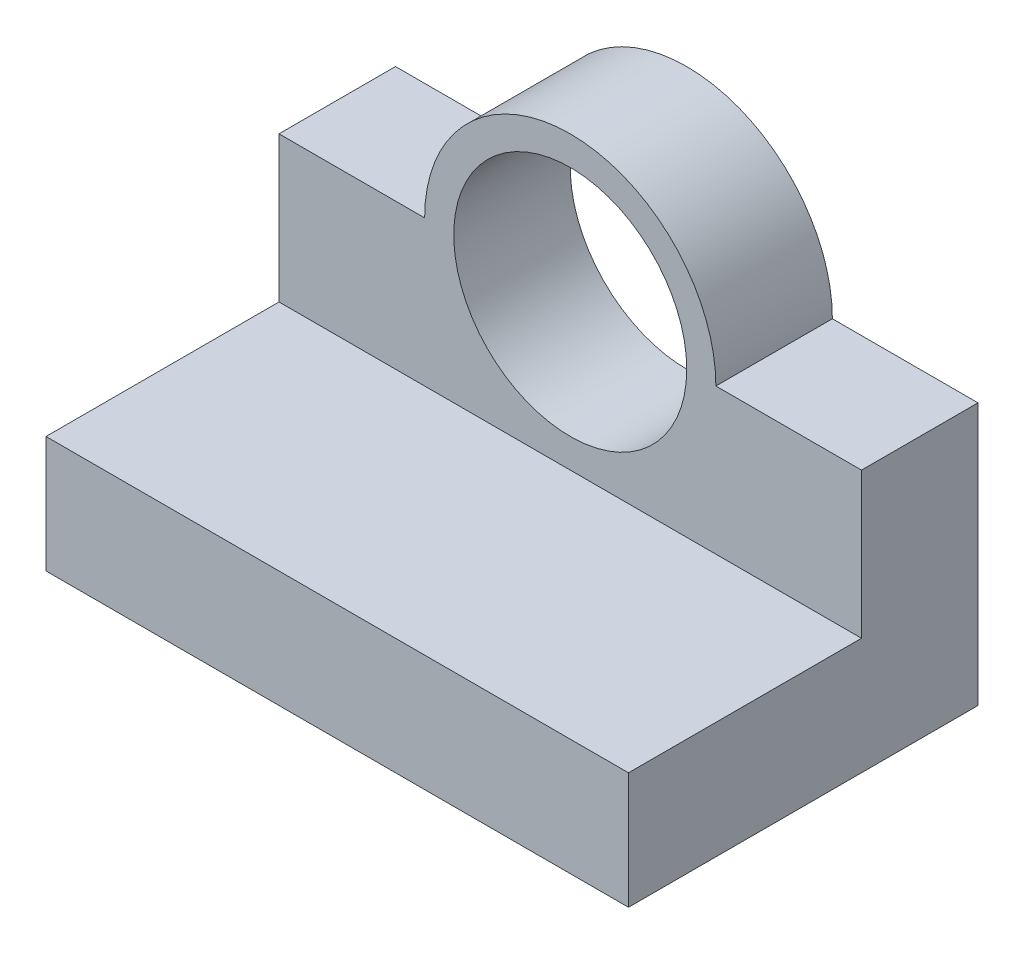
ISO-10303-21;
HEADER;
FILE_DESCRIPTION(('STEP AP214'),'2;1');
FILE_NAME('part.step','',(''),(''),'','','');
FILE_SCHEMA(('AUTOMOTIVE_DESIGN { 1 0 10303 214 1 1 1 1 }'));
ENDSEC;
DATA;
#1=APPLICATION_CONTEXT('core data for automotive mechanical design processes');
#2=APPLICATION_PROTOCOL_DEFINITION('international standard','automotive_design',2000,#1);
#3=PRODUCT_CONTEXT('',#1,'mechanical');
#4=PRODUCT('Part','Part','',(#3));
#5=PRODUCT_RELATED_PRODUCT_CATEGORY('part','',(#4));
#6=PRODUCT_DEFINITION_FORMATION('','',#4);
#7=PRODUCT_DEFINITION_CONTEXT('part definition',#1,'design');
#8=PRODUCT_DEFINITION('design','',#6,#7);
#9=PRODUCT_DEFINITION_SHAPE('','',#8);
#10=(LENGTH_UNIT() NAMED_UNIT(*) SI_UNIT(.MILLI.,.METRE.));
#11=(NAMED_UNIT(*) PLANE_ANGLE_UNIT() SI_UNIT($,.RADIAN.));
#12=(NAMED_UNIT(*) SI_UNIT($,.STERADIAN.) SOLID_ANGLE_UNIT());
#13=UNCERTAINTY_MEASURE_WITH_UNIT(LENGTH_MEASURE(1.E-05),#10,'distance_accuracy_value','');
#14=(GEOMETRIC_REPRESENTATION_CONTEXT(3) GLOBAL_UNCERTAINTY_ASSIGNED_CONTEXT((#13)) GLOBAL_UNIT_ASSIGNED_CONTEXT((#10,
#11,#12)) REPRESENTATION_CONTEXT('',''));
#15=CARTESIAN_POINT('',(0.,0.,0.));
#16=DIRECTION('',(0.,0.,1.));
#17=DIRECTION('',(1.,0.,0.));
#18=AXIS2_PLACEMENT_3D('',#15,#16,#17);
#19=CARTESIAN_POINT('',(0.,45.,10.));
#20=DIRECTION('',(0.,0.,1.));
#21=DIRECTION('',(1.,0.,0.));
#22=AXIS2_PLACEMENT_3D('',#19,#20,#21);
#23=PLANE('',#22);
#24=DIRECTION('',(-1.,0.,0.));
#25=VECTOR('',#24,1.);
#26=CARTESIAN_POINT('',(-50.,20.,10.));
#27=LINE('',#26,#25);
#28=CARTESIAN_POINT('',(50.,20.,10.));
#29=VERTEX_POINT('',#28);
#30=CARTESIAN_POINT('',(-50.,20.,10.));
#31=VERTEX_POINT('',#30);
#32=EDGE_CURVE('E49',#29,#31,#27,.T.);
#33=ORIENTED_EDGE('',*,*,#32,.F.);
#34=DIRECTION('',(0.,1.,0.));
#35=VECTOR('',#34,1.);
#36=CARTESIAN_POINT('',(50.,0.,10.));
#37=LINE('',#36,#35);
#38=CARTESIAN_POINT('',(50.,45.,10.));
#39=VERTEX_POINT('',#38);
#40=EDGE_CURVE('E87',#29,#39,#37,.T.);
#41=ORIENTED_EDGE('',*,*,#40,.T.);
#42=DIRECTION('',(-1.,0.,0.));
#43=VECTOR('',#42,1.);
#44=CARTESIAN_POINT('',(25.,45.,10.));
#45=LINE('',#44,#43);
#46=CARTESIAN_POINT('',(25.,45.,10.));
#47=VERTEX_POINT('',#46);
#48=EDGE_CURVE('E143',#39,#47,#45,.T.);
#49=ORIENTED_EDGE('',*,*,#48,.T.);
#50=CARTESIAN_POINT('',(0.,45.,10.));
#51=DIRECTION('',(0.,0.,1.));
#52=DIRECTION('',(1.,0.,0.));
#53=AXIS2_PLACEMENT_3D('',#50,#51,#52);
#54=CIRCLE('',#53,25.);
#55=CARTESIAN_POINT('',(-25.,45.,10.));
#56=VERTEX_POINT('',#55);
#57=EDGE_CURVE('E145',#47,#56,#54,.T.);
#58=ORIENTED_EDGE('',*,*,#57,.T.);
#59=DIRECTION('',(-1.,0.,0.));
#60=VECTOR('',#59,1.);
#61=CARTESIAN_POINT('',(-50.,45.,10.));
#62=LINE('',#61,#60);
#63=CARTESIAN_POINT('',(-50.,45.,10.));
#64=VERTEX_POINT('',#63);
#65=EDGE_CURVE('E56',#56,#64,#62,.T.);
#66=ORIENTED_EDGE('',*,*,#65,.T.);
#67=DIRECTION('',(0.,-1.,0.));
#68=VECTOR('',#67,1.);
#69=CARTESIAN_POINT('',(-50.,0.,10.));
#70=LINE('',#69,#68);
#71=EDGE_CURVE('E140',#64,#31,#70,.T.);
#72=ORIENTED_EDGE('',*,*,#71,.T.);
#73=EDGE_LOOP('',(#33,#41,#49,#58,#66,#72));
#74=FACE_BOUND('',#73,.T.);
#75=CARTESIAN_POINT('',(0.,45.,10.));
#76=DIRECTION('',(0.,0.,1.));
#77=DIRECTION('',(1.,0.,0.));
#78=AXIS2_PLACEMENT_3D('',#75,#76,#77);
#79=CIRCLE('',#78,20.);
#80=CARTESIAN_POINT('',(20.,45.,10.));
#81=VERTEX_POINT('',#80);
#82=EDGE_CURVE('E135',#81,#81,#79,.T.);
#83=ORIENTED_EDGE('',*,*,#82,.F.);
#84=EDGE_LOOP('',(#83));
#85=FACE_BOUND('',#84,.T.);
#86=ADVANCED_FACE('F34',(#74,#85),#23,.T.);
#87=CARTESIAN_POINT('',(0.,45.,-10.));
#88=DIRECTION('',(0.,0.,1.));
#89=DIRECTION('',(1.,0.,0.));
#90=AXIS2_PLACEMENT_3D('',#87,#88,#89);
#91=PLANE('',#90);
#92=DIRECTION('',(0.,-1.,0.));
#93=VECTOR('',#92,1.);
#94=CARTESIAN_POINT('',(-50.,0.,-10.));
#95=LINE('',#94,#93);
#96=CARTESIAN_POINT('',(-50.,45.,-10.));
#97=VERTEX_POINT('',#96);
#98=CARTESIAN_POINT('',(-50.,0.,-10.));
#99=VERTEX_POINT('',#98);
#100=EDGE_CURVE('E110',#97,#99,#95,.T.);
#101=ORIENTED_EDGE('',*,*,#100,.F.);
#102=DIRECTION('',(-1.,0.,0.));
#103=VECTOR('',#102,1.);
#104=CARTESIAN_POINT('',(-50.,45.,-10.));
#105=LINE('',#104,#103);
#106=CARTESIAN_POINT('',(-25.,45.,-10.));
#107=VERTEX_POINT('',#106);
#108=EDGE_CURVE('E83',#107,#97,#105,.T.);
#109=ORIENTED_EDGE('',*,*,#108,.F.);
#110=CARTESIAN_POINT('',(0.,45.,-10.));
#111=DIRECTION('',(0.,0.,1.));
#112=DIRECTION('',(1.,0.,0.));
#113=AXIS2_PLACEMENT_3D('',#110,#111,#112);
#114=CIRCLE('',#113,25.);
#115=CARTESIAN_POINT('',(25.,45.,-10.));
#116=VERTEX_POINT('',#115);
#117=EDGE_CURVE('E156',#116,#107,#114,.T.);
#118=ORIENTED_EDGE('',*,*,#117,.F.);
#119=DIRECTION('',(-1.,0.,0.));
#120=VECTOR('',#119,1.);
#121=CARTESIAN_POINT('',(25.,45.,-10.));
#122=LINE('',#121,#120);
#123=CARTESIAN_POINT('',(50.,45.,-10.));
#124=VERTEX_POINT('',#123);
#125=EDGE_CURVE('E154',#124,#116,#122,.T.);
#126=ORIENTED_EDGE('',*,*,#125,.F.);
#127=DIRECTION('',(0.,1.,0.));
#128=VECTOR('',#127,1.);
#129=CARTESIAN_POINT('',(50.,0.,-10.));
#130=LINE('',#129,#128);
#131=CARTESIAN_POINT('',(50.,0.,-10.));
#132=VERTEX_POINT('',#131);
#133=EDGE_CURVE('E152',#132,#124,#130,.T.);
#134=ORIENTED_EDGE('',*,*,#133,.F.);
#135=DIRECTION('',(1.,0.,0.));
#136=VECTOR('',#135,1.);
#137=CARTESIAN_POINT('',(-50.,0.,-10.));
#138=LINE('',#137,#136);
#139=EDGE_CURVE('E150',#99,#132,#138,.T.);
#140=ORIENTED_EDGE('',*,*,#139,.F.);
#141=EDGE_LOOP('',(#101,#109,#118,#126,#134,#140));
#142=FACE_BOUND('',#141,.T.);
#143=CARTESIAN_POINT('',(0.,45.,-10.));
#144=DIRECTION('',(0.,0.,1.));
#145=DIRECTION('',(1.,0.,0.));
#146=AXIS2_PLACEMENT_3D('',#143,#144,#145);
#147=CIRCLE('',#146,20.);
#148=CARTESIAN_POINT('',(20.,45.,-10.));
#149=VERTEX_POINT('',#148);
#150=EDGE_CURVE('E134',#149,#149,#147,.T.);
#151=ORIENTED_EDGE('',*,*,#150,.T.);
#152=EDGE_LOOP('',(#151));
#153=FACE_BOUND('',#152,.T.);
#154=ADVANCED_FACE('F173',(#142,#153),#91,.F.);
#155=CARTESIAN_POINT('',(-50.,0.,10.));
#156=DIRECTION('',(1.,0.,0.));
#157=DIRECTION('',(0.,0.,-1.));
#158=AXIS2_PLACEMENT_3D('',#155,#156,#157);
#159=PLANE('',#158);
#160=ORIENTED_EDGE('',*,*,#100,.T.);
#161=DIRECTION('',(0.,0.,-1.));
#162=VECTOR('',#161,1.);
#163=CARTESIAN_POINT('',(-50.,0.,10.));
#164=LINE('',#163,#162);
#165=CARTESIAN_POINT('',(-50.,0.,50.));
#166=VERTEX_POINT('',#165);
#167=EDGE_CURVE('E11',#166,#99,#164,.T.);
#168=ORIENTED_EDGE('',*,*,#167,.F.);
#169=DIRECTION('',(0.,-1.,0.));
#170=VECTOR('',#169,1.);
#171=CARTESIAN_POINT('',(-50.,0.,50.));
#172=LINE('',#171,#170);
#173=CARTESIAN_POINT('',(-50.,20.,50.));
#174=VERTEX_POINT('',#173);
#175=EDGE_CURVE('E108',#174,#166,#172,.T.);
#176=ORIENTED_EDGE('',*,*,#175,.F.);
#177=DIRECTION('',(0.,0.,-1.));
#178=VECTOR('',#177,1.);
#179=CARTESIAN_POINT('',(-50.,20.,50.));
#180=LINE('',#179,#178);
#181=EDGE_CURVE('E128',#174,#31,#180,.T.);
#182=ORIENTED_EDGE('',*,*,#181,.T.);
#183=ORIENTED_EDGE('',*,*,#71,.F.);
#184=DIRECTION('',(0.,0.,-1.));
#185=VECTOR('',#184,1.);
#186=CARTESIAN_POINT('',(-50.,45.,10.));
#187=LINE('',#186,#185);
#188=EDGE_CURVE('E148',#64,#97,#187,.T.);
#189=ORIENTED_EDGE('',*,*,#188,.T.);
#190=EDGE_LOOP('',(#160,#168,#176,#182,#183,#189));
#191=FACE_BOUND('',#190,.T.);
#192=ADVANCED_FACE('F36',(#191),#159,.F.);
#193=CARTESIAN_POINT('',(-50.,0.,10.));
#194=DIRECTION('',(0.,1.,0.));
#195=DIRECTION('',(0.,0.,1.));
#196=AXIS2_PLACEMENT_3D('',#193,#194,#195);
#197=PLANE('',#196);
#198=ORIENTED_EDGE('',*,*,#139,.T.);
#199=DIRECTION('',(0.,0.,-1.));
#200=VECTOR('',#199,1.);
#201=CARTESIAN_POINT('',(50.,0.,10.));
#202=LINE('',#201,#200);
#203=CARTESIAN_POINT('',(50.,0.,50.));
#204=VERTEX_POINT('',#203);
#205=EDGE_CURVE('E42',#204,#132,#202,.T.);
#206=ORIENTED_EDGE('',*,*,#205,.F.);
#207=DIRECTION('',(1.,0.,0.));
#208=VECTOR('',#207,1.);
#209=CARTESIAN_POINT('',(-50.,0.,50.));
#210=LINE('',#209,#208);
#211=EDGE_CURVE('E113',#166,#204,#210,.T.);
#212=ORIENTED_EDGE('',*,*,#211,.F.);
#213=ORIENTED_EDGE('',*,*,#167,.T.);
#214=EDGE_LOOP('',(#198,#206,#212,#213));
#215=FACE_BOUND('',#214,.T.);
#216=ADVANCED_FACE('F114',(#215),#197,.F.);
#217=CARTESIAN_POINT('',(50.,0.,10.));
#218=DIRECTION('',(-1.,0.,0.));
#219=DIRECTION('',(0.,0.,1.));
#220=AXIS2_PLACEMENT_3D('',#217,#218,#219);
#221=PLANE('',#220);
#222=ORIENTED_EDGE('',*,*,#133,.T.);
#223=DIRECTION('',(0.,0.,-1.));
#224=VECTOR('',#223,1.);
#225=CARTESIAN_POINT('',(50.,45.,10.));
#226=LINE('',#225,#224);
#227=EDGE_CURVE('E165',#39,#124,#226,.T.);
#228=ORIENTED_EDGE('',*,*,#227,.F.);
#229=ORIENTED_EDGE('',*,*,#40,.F.);
#230=DIRECTION('',(0.,0.,-1.));
#231=VECTOR('',#230,1.);
#232=CARTESIAN_POINT('',(50.,20.,50.));
#233=LINE('',#232,#231);
#234=CARTESIAN_POINT('',(50.,20.,50.));
#235=VERTEX_POINT('',#234);
#236=EDGE_CURVE('E131',#235,#29,#233,.T.);
#237=ORIENTED_EDGE('',*,*,#236,.F.);
#238=DIRECTION('',(0.,1.,0.));
#239=VECTOR('',#238,1.);
#240=CARTESIAN_POINT('',(50.,0.,50.));
#241=LINE('',#240,#239);
#242=EDGE_CURVE('E118',#204,#235,#241,.T.);
#243=ORIENTED_EDGE('',*,*,#242,.F.);
#244=ORIENTED_EDGE('',*,*,#205,.T.);
#245=EDGE_LOOP('',(#222,#228,#229,#237,#243,#244));
#246=FACE_BOUND('',#245,.T.);
#247=ADVANCED_FACE('F169',(#246),#221,.F.);
#248=CARTESIAN_POINT('',(25.,45.,10.));
#249=DIRECTION('',(0.,-1.,0.));
#250=DIRECTION('',(1.,0.,0.));
#251=AXIS2_PLACEMENT_3D('',#248,#249,#250);
#252=PLANE('',#251);
#253=ORIENTED_EDGE('',*,*,#125,.T.);
#254=DIRECTION('',(0.,0.,-1.));
#255=VECTOR('',#254,1.);
#256=CARTESIAN_POINT('',(25.,45.,10.));
#257=LINE('',#256,#255);
#258=EDGE_CURVE('E162',#47,#116,#257,.T.);
#259=ORIENTED_EDGE('',*,*,#258,.F.);
#260=ORIENTED_EDGE('',*,*,#48,.F.);
#261=ORIENTED_EDGE('',*,*,#227,.T.);
#262=EDGE_LOOP('',(#253,#259,#260,#261));
#263=FACE_BOUND('',#262,.T.);
#264=ADVANCED_FACE('F178',(#263),#252,.F.);
#265=CARTESIAN_POINT('',(0.,45.,10.));
#266=DIRECTION('',(0.,0.,-1.));
#267=DIRECTION('',(-1.,0.,0.));
#268=AXIS2_PLACEMENT_3D('',#265,#266,#267);
#269=CYLINDRICAL_SURFACE('',#268,25.);
#270=ORIENTED_EDGE('',*,*,#117,.T.);
#271=DIRECTION('',(0.,0.,-1.));
#272=VECTOR('',#271,1.);
#273=CARTESIAN_POINT('',(-25.,45.,10.));
#274=LINE('',#273,#272);
#275=EDGE_CURVE('E160',#56,#107,#274,.T.);
#276=ORIENTED_EDGE('',*,*,#275,.F.);
#277=ORIENTED_EDGE('',*,*,#57,.F.);
#278=ORIENTED_EDGE('',*,*,#258,.T.);
#279=EDGE_LOOP('',(#270,#276,#277,#278));
#280=FACE_BOUND('',#279,.T.);
#281=ADVANCED_FACE('F182',(#280),#269,.T.);
#282=CARTESIAN_POINT('',(-50.,45.,10.));
#283=DIRECTION('',(0.,-1.,0.));
#284=DIRECTION('',(1.,0.,0.));
#285=AXIS2_PLACEMENT_3D('',#282,#283,#284);
#286=PLANE('',#285);
#287=ORIENTED_EDGE('',*,*,#108,.T.);
#288=ORIENTED_EDGE('',*,*,#188,.F.);
#289=ORIENTED_EDGE('',*,*,#65,.F.);
#290=ORIENTED_EDGE('',*,*,#275,.T.);
#291=EDGE_LOOP('',(#287,#288,#289,#290));
#292=FACE_BOUND('',#291,.T.);
#293=ADVANCED_FACE('F193',(#292),#286,.F.);
#294=CARTESIAN_POINT('',(0.,45.,10.));
#295=DIRECTION('',(0.,0.,-1.));
#296=DIRECTION('',(-1.,0.,0.));
#297=AXIS2_PLACEMENT_3D('',#294,#295,#296);
#298=CYLINDRICAL_SURFACE('',#297,20.);
#299=ORIENTED_EDGE('',*,*,#82,.T.);
#300=EDGE_LOOP('',(#299));
#301=FACE_BOUND('',#300,.T.);
#302=ORIENTED_EDGE('',*,*,#150,.F.);
#303=EDGE_LOOP('',(#302));
#304=FACE_BOUND('',#303,.T.);
#305=ADVANCED_FACE('F189',(#301,#304),#298,.F.);
#306=CARTESIAN_POINT('',(-50.,20.,50.));
#307=DIRECTION('',(0.,-1.,0.));
#308=DIRECTION('',(0.,0.,-1.));
#309=AXIS2_PLACEMENT_3D('',#306,#307,#308);
#310=PLANE('',#309);
#311=ORIENTED_EDGE('',*,*,#32,.T.);
#312=ORIENTED_EDGE('',*,*,#181,.F.);
#313=DIRECTION('',(-1.,0.,0.));
#314=VECTOR('',#313,1.);
#315=CARTESIAN_POINT('',(-50.,20.,50.));
#316=LINE('',#315,#314);
#317=EDGE_CURVE('E122',#235,#174,#316,.T.);
#318=ORIENTED_EDGE('',*,*,#317,.F.);
#319=ORIENTED_EDGE('',*,*,#236,.T.);
#320=EDGE_LOOP('',(#311,#312,#318,#319));
#321=FACE_BOUND('',#320,.T.);
#322=ADVANCED_FACE('F192',(#321),#310,.F.);
#323=CARTESIAN_POINT('',(0.,0.,50.));
#324=DIRECTION('',(0.,0.,-1.));
#325=DIRECTION('',(-1.,0.,0.));
#326=AXIS2_PLACEMENT_3D('',#323,#324,#325);
#327=PLANE('',#326);
#328=ORIENTED_EDGE('',*,*,#175,.T.);
#329=ORIENTED_EDGE('',*,*,#211,.T.);
#330=ORIENTED_EDGE('',*,*,#242,.T.);
#331=ORIENTED_EDGE('',*,*,#317,.T.);
#332=EDGE_LOOP('',(#328,#329,#330,#331));
#333=FACE_BOUND('',#332,.T.);
#334=ADVANCED_FACE('F120',(#333),#327,.F.);
#335=CLOSED_SHELL('',(#86,#154,#192,#216,#247,#264,#281,#293,#305,#322,#334));
#336=MANIFOLD_SOLID_BREP('B2',#335);
#337=ADVANCED_BREP_SHAPE_REPRESENTATION('',(#18,#336),#14);
#338=SHAPE_DEFINITION_REPRESENTATION(#9,#337);
ENDSEC;
END-ISO-10303-21;
